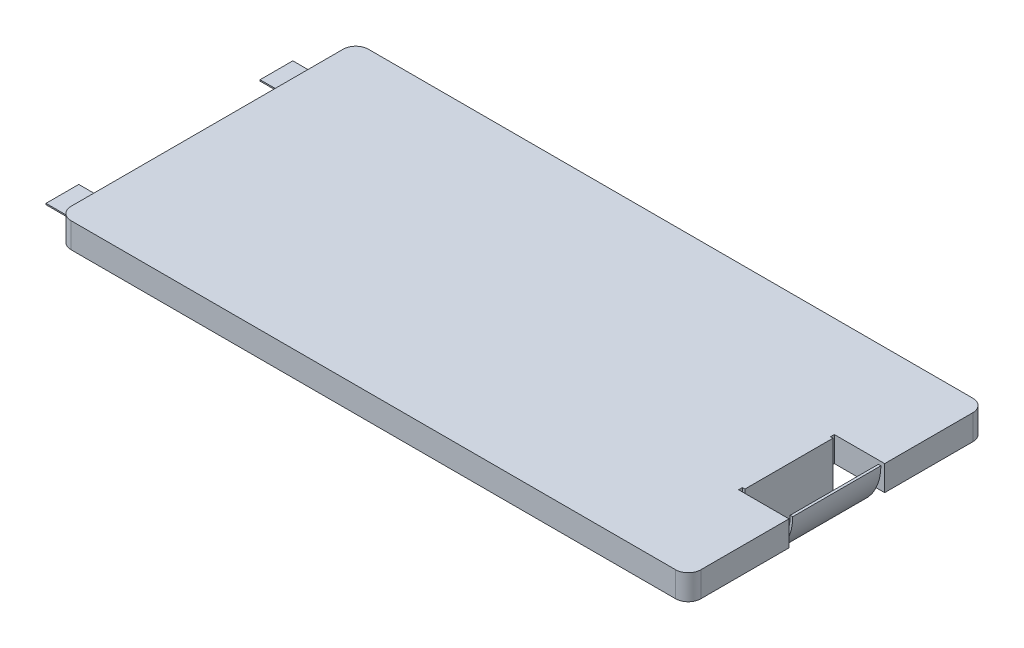
ISO-10303-21;
HEADER;
FILE_DESCRIPTION(('STEP AP214'),'2;1');
FILE_NAME('part.step','',(''),(''),'','','');
FILE_SCHEMA(('AUTOMOTIVE_DESIGN { 1 0 10303 214 1 1 1 1 }'));
ENDSEC;
DATA;
#1=APPLICATION_CONTEXT('core data for automotive mechanical design processes');
#2=APPLICATION_PROTOCOL_DEFINITION('international standard','automotive_design',2000,#1);
#3=PRODUCT_CONTEXT('',#1,'mechanical');
#4=PRODUCT('Part','Part','',(#3));
#5=PRODUCT_RELATED_PRODUCT_CATEGORY('part','',(#4));
#6=PRODUCT_DEFINITION_FORMATION('','',#4);
#7=PRODUCT_DEFINITION_CONTEXT('part definition',#1,'design');
#8=PRODUCT_DEFINITION('design','',#6,#7);
#9=PRODUCT_DEFINITION_SHAPE('','',#8);
#10=(LENGTH_UNIT() NAMED_UNIT(*) SI_UNIT(.MILLI.,.METRE.));
#11=(NAMED_UNIT(*) PLANE_ANGLE_UNIT() SI_UNIT($,.RADIAN.));
#12=(NAMED_UNIT(*) SI_UNIT($,.STERADIAN.) SOLID_ANGLE_UNIT());
#13=UNCERTAINTY_MEASURE_WITH_UNIT(LENGTH_MEASURE(1.E-05),#10,'distance_accuracy_value','');
#14=(GEOMETRIC_REPRESENTATION_CONTEXT(3) GLOBAL_UNCERTAINTY_ASSIGNED_CONTEXT((#13)) GLOBAL_UNIT_ASSIGNED_CONTEXT((#10,
#11,#12)) REPRESENTATION_CONTEXT('',''));
#15=CARTESIAN_POINT('',(0.,0.,0.));
#16=DIRECTION('',(0.,0.,1.));
#17=DIRECTION('',(1.,0.,0.));
#18=AXIS2_PLACEMENT_3D('',#15,#16,#17);
#19=CARTESIAN_POINT('',(-35.56,0.,-12.446));
#20=DIRECTION('',(0.,0.,1.));
#21=DIRECTION('',(0.,-1.,0.));
#22=AXIS2_PLACEMENT_3D('',#19,#20,#21);
#23=PLANE('',#22);
#24=DIRECTION('',(1.,0.,0.));
#25=VECTOR('',#24,1.);
#26=CARTESIAN_POINT('',(-35.56,0.127,-12.446));
#27=LINE('',#26,#25);
#28=CARTESIAN_POINT('',(-35.56,0.127,-12.446));
#29=VERTEX_POINT('',#28);
#30=CARTESIAN_POINT('',(-31.75,0.127,-12.446));
#31=VERTEX_POINT('',#30);
#32=EDGE_CURVE('E64',#29,#31,#27,.T.);
#33=ORIENTED_EDGE('',*,*,#32,.F.);
#34=DIRECTION('',(0.,-1.,0.));
#35=VECTOR('',#34,1.);
#36=CARTESIAN_POINT('',(-35.56,0.,-12.446));
#37=LINE('',#36,#35);
#38=CARTESIAN_POINT('',(-35.56,0.254,-12.446));
#39=VERTEX_POINT('',#38);
#40=EDGE_CURVE('E93',#39,#29,#37,.T.);
#41=ORIENTED_EDGE('',*,*,#40,.F.);
#42=DIRECTION('',(1.,0.,0.));
#43=VECTOR('',#42,1.);
#44=CARTESIAN_POINT('',(-35.56,0.254,-12.446));
#45=LINE('',#44,#43);
#46=CARTESIAN_POINT('',(-31.75,0.254,-12.446));
#47=VERTEX_POINT('',#46);
#48=EDGE_CURVE('E57',#39,#47,#45,.T.);
#49=ORIENTED_EDGE('',*,*,#48,.T.);
#50=DIRECTION('',(0.,-1.,0.));
#51=VECTOR('',#50,1.);
#52=CARTESIAN_POINT('',(-31.75,0.,-12.446));
#53=LINE('',#52,#51);
#54=EDGE_CURVE('E98',#47,#31,#53,.T.);
#55=ORIENTED_EDGE('',*,*,#54,.T.);
#56=EDGE_LOOP('',(#33,#41,#49,#55));
#57=FACE_BOUND('',#56,.T.);
#58=ADVANCED_FACE('F50',(#57),#23,.F.);
#59=CARTESIAN_POINT('',(-35.56,0.,-9.144));
#60=DIRECTION('',(0.,0.,-1.));
#61=DIRECTION('',(0.,1.,0.));
#62=AXIS2_PLACEMENT_3D('',#59,#60,#61);
#63=PLANE('',#62);
#64=DIRECTION('',(1.,0.,0.));
#65=VECTOR('',#64,1.);
#66=CARTESIAN_POINT('',(-35.56,0.127,-9.144));
#67=LINE('',#66,#65);
#68=CARTESIAN_POINT('',(-35.56,0.127,-9.144));
#69=VERTEX_POINT('',#68);
#70=CARTESIAN_POINT('',(-31.75,0.127,-9.144));
#71=VERTEX_POINT('',#70);
#72=EDGE_CURVE('E101',#69,#71,#67,.T.);
#73=ORIENTED_EDGE('',*,*,#72,.T.);
#74=DIRECTION('',(0.,1.,0.));
#75=VECTOR('',#74,1.);
#76=CARTESIAN_POINT('',(-31.75,0.,-9.144));
#77=LINE('',#76,#75);
#78=CARTESIAN_POINT('',(-31.75,0.254,-9.144));
#79=VERTEX_POINT('',#78);
#80=EDGE_CURVE('E94',#71,#79,#77,.T.);
#81=ORIENTED_EDGE('',*,*,#80,.T.);
#82=DIRECTION('',(1.,0.,0.));
#83=VECTOR('',#82,1.);
#84=CARTESIAN_POINT('',(-35.56,0.254,-9.144));
#85=LINE('',#84,#83);
#86=CARTESIAN_POINT('',(-35.56,0.254,-9.144));
#87=VERTEX_POINT('',#86);
#88=EDGE_CURVE('E12',#87,#79,#85,.T.);
#89=ORIENTED_EDGE('',*,*,#88,.F.);
#90=DIRECTION('',(0.,1.,0.));
#91=VECTOR('',#90,1.);
#92=CARTESIAN_POINT('',(-35.56,0.,-9.144));
#93=LINE('',#92,#91);
#94=EDGE_CURVE('E108',#69,#87,#93,.T.);
#95=ORIENTED_EDGE('',*,*,#94,.F.);
#96=EDGE_LOOP('',(#73,#81,#89,#95));
#97=FACE_BOUND('',#96,.T.);
#98=ADVANCED_FACE('F122',(#97),#63,.F.);
#99=CARTESIAN_POINT('',(-35.56,0.,0.));
#100=DIRECTION('',(1.,0.,0.));
#101=DIRECTION('',(0.,0.,-1.));
#102=AXIS2_PLACEMENT_3D('',#99,#100,#101);
#103=PLANE('',#102);
#104=DIRECTION('',(0.,0.,-1.));
#105=VECTOR('',#104,1.);
#106=CARTESIAN_POINT('',(-35.56,0.127,-12.446));
#107=LINE('',#106,#105);
#108=EDGE_CURVE('E112',#69,#29,#107,.T.);
#109=ORIENTED_EDGE('',*,*,#108,.F.);
#110=ORIENTED_EDGE('',*,*,#94,.T.);
#111=DIRECTION('',(0.,0.,-1.));
#112=VECTOR('',#111,1.);
#113=CARTESIAN_POINT('',(-35.56,0.254,-12.446));
#114=LINE('',#113,#112);
#115=EDGE_CURVE('E73',#87,#39,#114,.T.);
#116=ORIENTED_EDGE('',*,*,#115,.T.);
#117=ORIENTED_EDGE('',*,*,#40,.T.);
#118=EDGE_LOOP('',(#109,#110,#116,#117));
#119=FACE_BOUND('',#118,.T.);
#120=ADVANCED_FACE('F120',(#119),#103,.F.);
#121=CARTESIAN_POINT('',(-31.75,0.,0.));
#122=DIRECTION('',(1.,0.,0.));
#123=DIRECTION('',(0.,0.,-1.));
#124=AXIS2_PLACEMENT_3D('',#121,#122,#123);
#125=PLANE('',#124);
#126=ORIENTED_EDGE('',*,*,#80,.F.);
#127=DIRECTION('',(0.,0.,-1.));
#128=VECTOR('',#127,1.);
#129=CARTESIAN_POINT('',(-31.75,0.127,-12.446));
#130=LINE('',#129,#128);
#131=EDGE_CURVE('E100',#71,#31,#130,.T.);
#132=ORIENTED_EDGE('',*,*,#131,.T.);
#133=ORIENTED_EDGE('',*,*,#54,.F.);
#134=DIRECTION('',(0.,0.,-1.));
#135=VECTOR('',#134,1.);
#136=CARTESIAN_POINT('',(-31.75,0.254,-12.446));
#137=LINE('',#136,#135);
#138=EDGE_CURVE('E85',#79,#47,#137,.T.);
#139=ORIENTED_EDGE('',*,*,#138,.F.);
#140=EDGE_LOOP('',(#126,#132,#133,#139));
#141=FACE_BOUND('',#140,.T.);
#142=ADVANCED_FACE('F99',(#141),#125,.T.);
#143=CARTESIAN_POINT('',(-35.56,0.254,-12.446));
#144=DIRECTION('',(0.,-1.,0.));
#145=DIRECTION('',(0.,0.,-1.));
#146=AXIS2_PLACEMENT_3D('',#143,#144,#145);
#147=PLANE('',#146);
#148=ORIENTED_EDGE('',*,*,#138,.T.);
#149=ORIENTED_EDGE('',*,*,#48,.F.);
#150=ORIENTED_EDGE('',*,*,#115,.F.);
#151=ORIENTED_EDGE('',*,*,#88,.T.);
#152=EDGE_LOOP('',(#148,#149,#150,#151));
#153=FACE_BOUND('',#152,.T.);
#154=ADVANCED_FACE('F87',(#153),#147,.F.);
#155=CARTESIAN_POINT('',(-35.56,0.127,-12.446));
#156=DIRECTION('',(0.,-1.,0.));
#157=DIRECTION('',(0.,0.,-1.));
#158=AXIS2_PLACEMENT_3D('',#155,#156,#157);
#159=PLANE('',#158);
#160=ORIENTED_EDGE('',*,*,#131,.F.);
#161=ORIENTED_EDGE('',*,*,#72,.F.);
#162=ORIENTED_EDGE('',*,*,#108,.T.);
#163=ORIENTED_EDGE('',*,*,#32,.T.);
#164=EDGE_LOOP('',(#160,#161,#162,#163));
#165=FACE_BOUND('',#164,.T.);
#166=ADVANCED_FACE('F116',(#165),#159,.T.);
#167=CLOSED_SHELL('',(#58,#98,#120,#142,#154,#166));
#168=MANIFOLD_SOLID_BREP('B2',#167);
#169=CARTESIAN_POINT('',(-35.56,0.,9.144));
#170=DIRECTION('',(0.,0.,1.));
#171=DIRECTION('',(1.,0.,0.));
#172=AXIS2_PLACEMENT_3D('',#169,#170,#171);
#173=PLANE('',#172);
#174=DIRECTION('',(1.,0.,0.));
#175=VECTOR('',#174,1.);
#176=CARTESIAN_POINT('',(-35.56,0.127,9.144));
#177=LINE('',#176,#175);
#178=CARTESIAN_POINT('',(-35.56,0.127,9.144));
#179=VERTEX_POINT('',#178);
#180=CARTESIAN_POINT('',(-31.75,0.127,9.144));
#181=VERTEX_POINT('',#180);
#182=EDGE_CURVE('E197',#179,#181,#177,.T.);
#183=ORIENTED_EDGE('',*,*,#182,.F.);
#184=DIRECTION('',(0.,-1.,0.));
#185=VECTOR('',#184,1.);
#186=CARTESIAN_POINT('',(-35.56,0.,9.144));
#187=LINE('',#186,#185);
#188=CARTESIAN_POINT('',(-35.56,0.254,9.144));
#189=VERTEX_POINT('',#188);
#190=EDGE_CURVE('E226',#189,#179,#187,.T.);
#191=ORIENTED_EDGE('',*,*,#190,.F.);
#192=DIRECTION('',(1.,0.,0.));
#193=VECTOR('',#192,1.);
#194=CARTESIAN_POINT('',(-35.56,0.254,9.144));
#195=LINE('',#194,#193);
#196=CARTESIAN_POINT('',(-31.75,0.254,9.144));
#197=VERTEX_POINT('',#196);
#198=EDGE_CURVE('E190',#189,#197,#195,.T.);
#199=ORIENTED_EDGE('',*,*,#198,.T.);
#200=DIRECTION('',(0.,-1.,0.));
#201=VECTOR('',#200,1.);
#202=CARTESIAN_POINT('',(-31.75,0.,9.144));
#203=LINE('',#202,#201);
#204=EDGE_CURVE('E231',#197,#181,#203,.T.);
#205=ORIENTED_EDGE('',*,*,#204,.T.);
#206=EDGE_LOOP('',(#183,#191,#199,#205));
#207=FACE_BOUND('',#206,.T.);
#208=ADVANCED_FACE('F183',(#207),#173,.F.);
#209=CARTESIAN_POINT('',(-35.56,0.,12.446));
#210=DIRECTION('',(0.,0.,-1.));
#211=DIRECTION('',(-1.,0.,0.));
#212=AXIS2_PLACEMENT_3D('',#209,#210,#211);
#213=PLANE('',#212);
#214=DIRECTION('',(1.,0.,0.));
#215=VECTOR('',#214,1.);
#216=CARTESIAN_POINT('',(-35.56,0.127,12.446));
#217=LINE('',#216,#215);
#218=CARTESIAN_POINT('',(-35.56,0.127,12.446));
#219=VERTEX_POINT('',#218);
#220=CARTESIAN_POINT('',(-31.75,0.127,12.446));
#221=VERTEX_POINT('',#220);
#222=EDGE_CURVE('E234',#219,#221,#217,.T.);
#223=ORIENTED_EDGE('',*,*,#222,.T.);
#224=DIRECTION('',(0.,1.,0.));
#225=VECTOR('',#224,1.);
#226=CARTESIAN_POINT('',(-31.75,0.,12.446));
#227=LINE('',#226,#225);
#228=CARTESIAN_POINT('',(-31.75,0.254,12.446));
#229=VERTEX_POINT('',#228);
#230=EDGE_CURVE('E227',#221,#229,#227,.T.);
#231=ORIENTED_EDGE('',*,*,#230,.T.);
#232=DIRECTION('',(1.,0.,0.));
#233=VECTOR('',#232,1.);
#234=CARTESIAN_POINT('',(-35.56,0.254,12.446));
#235=LINE('',#234,#233);
#236=CARTESIAN_POINT('',(-35.56,0.254,12.446));
#237=VERTEX_POINT('',#236);
#238=EDGE_CURVE('E48',#237,#229,#235,.T.);
#239=ORIENTED_EDGE('',*,*,#238,.F.);
#240=DIRECTION('',(0.,1.,0.));
#241=VECTOR('',#240,1.);
#242=CARTESIAN_POINT('',(-35.56,0.,12.446));
#243=LINE('',#242,#241);
#244=EDGE_CURVE('E241',#219,#237,#243,.T.);
#245=ORIENTED_EDGE('',*,*,#244,.F.);
#246=EDGE_LOOP('',(#223,#231,#239,#245));
#247=FACE_BOUND('',#246,.T.);
#248=ADVANCED_FACE('F255',(#247),#213,.F.);
#249=CARTESIAN_POINT('',(-35.56,0.,0.));
#250=DIRECTION('',(1.,0.,0.));
#251=DIRECTION('',(0.,0.,-1.));
#252=AXIS2_PLACEMENT_3D('',#249,#250,#251);
#253=PLANE('',#252);
#254=DIRECTION('',(0.,0.,-1.));
#255=VECTOR('',#254,1.);
#256=CARTESIAN_POINT('',(-35.56,0.127,12.446));
#257=LINE('',#256,#255);
#258=EDGE_CURVE('E245',#219,#179,#257,.T.);
#259=ORIENTED_EDGE('',*,*,#258,.F.);
#260=ORIENTED_EDGE('',*,*,#244,.T.);
#261=DIRECTION('',(0.,0.,-1.));
#262=VECTOR('',#261,1.);
#263=CARTESIAN_POINT('',(-35.56,0.254,9.144));
#264=LINE('',#263,#262);
#265=EDGE_CURVE('E206',#237,#189,#264,.T.);
#266=ORIENTED_EDGE('',*,*,#265,.T.);
#267=ORIENTED_EDGE('',*,*,#190,.T.);
#268=EDGE_LOOP('',(#259,#260,#266,#267));
#269=FACE_BOUND('',#268,.T.);
#270=ADVANCED_FACE('F253',(#269),#253,.F.);
#271=CARTESIAN_POINT('',(-31.75,0.,0.));
#272=DIRECTION('',(1.,0.,0.));
#273=DIRECTION('',(0.,0.,-1.));
#274=AXIS2_PLACEMENT_3D('',#271,#272,#273);
#275=PLANE('',#274);
#276=ORIENTED_EDGE('',*,*,#230,.F.);
#277=DIRECTION('',(0.,0.,-1.));
#278=VECTOR('',#277,1.);
#279=CARTESIAN_POINT('',(-31.75,0.127,12.446));
#280=LINE('',#279,#278);
#281=EDGE_CURVE('E233',#221,#181,#280,.T.);
#282=ORIENTED_EDGE('',*,*,#281,.T.);
#283=ORIENTED_EDGE('',*,*,#204,.F.);
#284=DIRECTION('',(0.,0.,-1.));
#285=VECTOR('',#284,1.);
#286=CARTESIAN_POINT('',(-31.75,0.254,9.144));
#287=LINE('',#286,#285);
#288=EDGE_CURVE('E218',#229,#197,#287,.T.);
#289=ORIENTED_EDGE('',*,*,#288,.F.);
#290=EDGE_LOOP('',(#276,#282,#283,#289));
#291=FACE_BOUND('',#290,.T.);
#292=ADVANCED_FACE('F232',(#291),#275,.T.);
#293=CARTESIAN_POINT('',(-35.56,0.254,9.144));
#294=DIRECTION('',(0.,-1.,0.));
#295=DIRECTION('',(0.,0.,-1.));
#296=AXIS2_PLACEMENT_3D('',#293,#294,#295);
#297=PLANE('',#296);
#298=ORIENTED_EDGE('',*,*,#288,.T.);
#299=ORIENTED_EDGE('',*,*,#198,.F.);
#300=ORIENTED_EDGE('',*,*,#265,.F.);
#301=ORIENTED_EDGE('',*,*,#238,.T.);
#302=EDGE_LOOP('',(#298,#299,#300,#301));
#303=FACE_BOUND('',#302,.T.);
#304=ADVANCED_FACE('F220',(#303),#297,.F.);
#305=CARTESIAN_POINT('',(-35.56,0.127,12.446));
#306=DIRECTION('',(0.,-1.,0.));
#307=DIRECTION('',(0.,0.,-1.));
#308=AXIS2_PLACEMENT_3D('',#305,#306,#307);
#309=PLANE('',#308);
#310=ORIENTED_EDGE('',*,*,#281,.F.);
#311=ORIENTED_EDGE('',*,*,#222,.F.);
#312=ORIENTED_EDGE('',*,*,#258,.T.);
#313=ORIENTED_EDGE('',*,*,#182,.T.);
#314=EDGE_LOOP('',(#310,#311,#312,#313));
#315=FACE_BOUND('',#314,.T.);
#316=ADVANCED_FACE('F249',(#315),#309,.T.);
#317=CLOSED_SHELL('',(#208,#248,#270,#292,#304,#316));
#318=MANIFOLD_SOLID_BREP('B6',#317);
#319=CARTESIAN_POINT('',(26.67,0.,-4.826));
#320=DIRECTION('',(-1.,0.,0.));
#321=DIRECTION('',(0.,0.,1.));
#322=AXIS2_PLACEMENT_3D('',#319,#320,#321);
#323=PLANE('',#322);
#324=DIRECTION('',(0.,-1.,0.));
#325=VECTOR('',#324,1.);
#326=CARTESIAN_POINT('',(26.67,2.54,-4.445));
#327=LINE('',#326,#325);
#328=CARTESIAN_POINT('',(26.67,2.54,-4.445));
#329=VERTEX_POINT('',#328);
#330=CARTESIAN_POINT('',(26.67,0.,-4.445));
#331=VERTEX_POINT('',#330);
#332=EDGE_CURVE('E594',#329,#331,#327,.T.);
#333=ORIENTED_EDGE('',*,*,#332,.T.);
#334=DIRECTION('',(0.,0.,1.));
#335=VECTOR('',#334,1.);
#336=CARTESIAN_POINT('',(26.67,0.,-4.826));
#337=LINE('',#336,#335);
#338=CARTESIAN_POINT('',(26.67,0.,-4.826));
#339=VERTEX_POINT('',#338);
#340=EDGE_CURVE('E585',#339,#331,#337,.T.);
#341=ORIENTED_EDGE('',*,*,#340,.F.);
#342=DIRECTION('',(0.,1.,0.));
#343=VECTOR('',#342,1.);
#344=CARTESIAN_POINT('',(26.67,0.,-4.826));
#345=LINE('',#344,#343);
#346=CARTESIAN_POINT('',(26.67,2.54,-4.826));
#347=VERTEX_POINT('',#346);
#348=EDGE_CURVE('E504',#339,#347,#345,.T.);
#349=ORIENTED_EDGE('',*,*,#348,.T.);
#350=DIRECTION('',(0.,0.,1.));
#351=VECTOR('',#350,1.);
#352=CARTESIAN_POINT('',(26.67,2.54,-4.826));
#353=LINE('',#352,#351);
#354=EDGE_CURVE('E491',#347,#329,#353,.T.);
#355=ORIENTED_EDGE('',*,*,#354,.T.);
#356=EDGE_LOOP('',(#333,#341,#349,#355));
#357=FACE_BOUND('',#356,.T.);
#358=ADVANCED_FACE('F307',(#357),#323,.F.);
#359=CARTESIAN_POINT('',(0.,0.,0.));
#360=DIRECTION('',(0.,1.,0.));
#361=DIRECTION('',(0.,0.,1.));
#362=AXIS2_PLACEMENT_3D('',#359,#360,#361);
#363=PLANE('',#362);
#364=DIRECTION('',(-1.,0.,0.));
#365=VECTOR('',#364,1.);
#366=CARTESIAN_POINT('',(29.0565535122826,0.,3.556));
#367=LINE('',#366,#365);
#368=CARTESIAN_POINT('',(26.67,0.,3.556));
#369=VERTEX_POINT('',#368);
#370=CARTESIAN_POINT('',(24.2834464877174,0.,3.556));
#371=VERTEX_POINT('',#370);
#372=EDGE_CURVE('E181',#369,#371,#367,.T.);
#373=ORIENTED_EDGE('',*,*,#372,.F.);
#374=CARTESIAN_POINT('',(26.67,0.,4.445));
#375=VERTEX_POINT('',#374);
#376=EDGE_CURVE('E595',#369,#375,#337,.T.);
#377=ORIENTED_EDGE('',*,*,#376,.T.);
#378=CARTESIAN_POINT('',(26.67,0.,4.826));
#379=VERTEX_POINT('',#378);
#380=EDGE_CURVE('E482',#375,#379,#337,.T.);
#381=ORIENTED_EDGE('',*,*,#380,.T.);
#382=DIRECTION('',(1.,0.,0.));
#383=VECTOR('',#382,1.);
#384=CARTESIAN_POINT('',(36.83,0.,4.826));
#385=LINE('',#384,#383);
#386=CARTESIAN_POINT('',(31.75,0.,4.826));
#387=VERTEX_POINT('',#386);
#388=EDGE_CURVE('E499',#379,#387,#385,.T.);
#389=ORIENTED_EDGE('',*,*,#388,.T.);
#390=DIRECTION('',(0.,0.,-1.));
#391=VECTOR('',#390,1.);
#392=CARTESIAN_POINT('',(31.75,0.,-14.986));
#393=LINE('',#392,#391);
#394=CARTESIAN_POINT('',(31.75,0.,13.716));
#395=VERTEX_POINT('',#394);
#396=EDGE_CURVE('E529',#395,#387,#393,.T.);
#397=ORIENTED_EDGE('',*,*,#396,.F.);
#398=CARTESIAN_POINT('',(30.48,0.,13.716));
#399=DIRECTION('',(0.,1.,0.));
#400=DIRECTION('',(0.,0.,1.));
#401=AXIS2_PLACEMENT_3D('',#398,#399,#400);
#402=CIRCLE('',#401,1.27);
#403=CARTESIAN_POINT('',(30.48,0.,14.986));
#404=VERTEX_POINT('',#403);
#405=EDGE_CURVE('E544',#395,#404,#402,.F.);
#406=ORIENTED_EDGE('',*,*,#405,.T.);
#407=DIRECTION('',(1.,0.,0.));
#408=VECTOR('',#407,1.);
#409=CARTESIAN_POINT('',(-31.75,0.,14.986));
#410=LINE('',#409,#408);
#411=CARTESIAN_POINT('',(-30.48,0.,14.986));
#412=VERTEX_POINT('',#411);
#413=EDGE_CURVE('E537',#412,#404,#410,.T.);
#414=ORIENTED_EDGE('',*,*,#413,.F.);
#415=CARTESIAN_POINT('',(-30.48,0.,13.716));
#416=DIRECTION('',(0.,1.,0.));
#417=DIRECTION('',(0.,0.,1.));
#418=AXIS2_PLACEMENT_3D('',#415,#416,#417);
#419=CIRCLE('',#418,1.27);
#420=CARTESIAN_POINT('',(-31.75,0.,13.716));
#421=VERTEX_POINT('',#420);
#422=EDGE_CURVE('E549',#412,#421,#419,.F.);
#423=ORIENTED_EDGE('',*,*,#422,.T.);
#424=DIRECTION('',(0.,0.,1.));
#425=VECTOR('',#424,1.);
#426=CARTESIAN_POINT('',(-31.75,0.,-14.986));
#427=LINE('',#426,#425);
#428=CARTESIAN_POINT('',(-31.75,0.,-13.716));
#429=VERTEX_POINT('',#428);
#430=EDGE_CURVE('E535',#429,#421,#427,.T.);
#431=ORIENTED_EDGE('',*,*,#430,.F.);
#432=CARTESIAN_POINT('',(-30.48,0.,-13.716));
#433=DIRECTION('',(0.,1.,0.));
#434=DIRECTION('',(0.,0.,1.));
#435=AXIS2_PLACEMENT_3D('',#432,#433,#434);
#436=CIRCLE('',#435,1.27);
#437=CARTESIAN_POINT('',(-30.48,0.,-14.986));
#438=VERTEX_POINT('',#437);
#439=EDGE_CURVE('E552',#429,#438,#436,.F.);
#440=ORIENTED_EDGE('',*,*,#439,.T.);
#441=DIRECTION('',(-1.,0.,0.));
#442=VECTOR('',#441,1.);
#443=CARTESIAN_POINT('',(-31.75,0.,-14.986));
#444=LINE('',#443,#442);
#445=CARTESIAN_POINT('',(30.48,0.,-14.986));
#446=VERTEX_POINT('',#445);
#447=EDGE_CURVE('E532',#446,#438,#444,.T.);
#448=ORIENTED_EDGE('',*,*,#447,.F.);
#449=CARTESIAN_POINT('',(30.48,0.,-13.716));
#450=DIRECTION('',(0.,1.,0.));
#451=DIRECTION('',(0.,0.,1.));
#452=AXIS2_PLACEMENT_3D('',#449,#450,#451);
#453=CIRCLE('',#452,1.27);
#454=CARTESIAN_POINT('',(31.75,0.,-13.716));
#455=VERTEX_POINT('',#454);
#456=EDGE_CURVE('E546',#446,#455,#453,.F.);
#457=ORIENTED_EDGE('',*,*,#456,.T.);
#458=CARTESIAN_POINT('',(31.75,0.,-4.826));
#459=VERTEX_POINT('',#458);
#460=EDGE_CURVE('E515',#459,#455,#393,.T.);
#461=ORIENTED_EDGE('',*,*,#460,.F.);
#462=DIRECTION('',(-1.,0.,0.));
#463=VECTOR('',#462,1.);
#464=CARTESIAN_POINT('',(0.,0.,-4.826));
#465=LINE('',#464,#463);
#466=EDGE_CURVE('E311',#459,#339,#465,.T.);
#467=ORIENTED_EDGE('',*,*,#466,.T.);
#468=ORIENTED_EDGE('',*,*,#340,.T.);
#469=DIRECTION('',(0.,0.,-1.));
#470=VECTOR('',#469,1.);
#471=CARTESIAN_POINT('',(26.67,0.,0.));
#472=LINE('',#471,#470);
#473=CARTESIAN_POINT('',(26.67,0.,-3.556));
#474=VERTEX_POINT('',#473);
#475=EDGE_CURVE('E922',#474,#331,#472,.T.);
#476=ORIENTED_EDGE('',*,*,#475,.F.);
#477=DIRECTION('',(1.,0.,0.));
#478=VECTOR('',#477,1.);
#479=CARTESIAN_POINT('',(29.0565535122826,0.,-3.556));
#480=LINE('',#479,#478);
#481=CARTESIAN_POINT('',(24.2834464877174,0.,-3.556));
#482=VERTEX_POINT('',#481);
#483=EDGE_CURVE('E327',#482,#474,#480,.T.);
#484=ORIENTED_EDGE('',*,*,#483,.F.);
#485=DIRECTION('',(0.,0.,-1.));
#486=VECTOR('',#485,1.);
#487=CARTESIAN_POINT('',(24.2834464877174,0.,3.556));
#488=LINE('',#487,#486);
#489=EDGE_CURVE('E323',#371,#482,#488,.T.);
#490=ORIENTED_EDGE('',*,*,#489,.F.);
#491=EDGE_LOOP('',(#373,#377,#381,#389,#397,#406,#414,#423,#431,#440,#448,#457,#461,#467,#468,
#476,#484,#490));
#492=FACE_BOUND('',#491,.T.);
#493=ADVANCED_FACE('F583',(#492),#363,.F.);
#494=CARTESIAN_POINT('',(31.75,2.54,-14.986));
#495=DIRECTION('',(-1.,0.,0.));
#496=DIRECTION('',(0.,0.,1.));
#497=AXIS2_PLACEMENT_3D('',#494,#495,#496);
#498=PLANE('',#497);
#499=DIRECTION('',(0.,0.,-1.));
#500=VECTOR('',#499,1.);
#501=CARTESIAN_POINT('',(31.75,2.54,-14.986));
#502=LINE('',#501,#500);
#503=CARTESIAN_POINT('',(31.75,2.54,-4.826));
#504=VERTEX_POINT('',#503);
#505=CARTESIAN_POINT('',(31.75,2.54,-13.716));
#506=VERTEX_POINT('',#505);
#507=EDGE_CURVE('E519',#504,#506,#502,.T.);
#508=ORIENTED_EDGE('',*,*,#507,.F.);
#509=DIRECTION('',(0.,-1.,0.));
#510=VECTOR('',#509,1.);
#511=CARTESIAN_POINT('',(31.75,2.54,-4.826));
#512=LINE('',#511,#510);
#513=EDGE_CURVE('E512',#504,#459,#512,.T.);
#514=ORIENTED_EDGE('',*,*,#513,.T.);
#515=ORIENTED_EDGE('',*,*,#460,.T.);
#516=DIRECTION('',(0.,-1.,0.));
#517=VECTOR('',#516,1.);
#518=CARTESIAN_POINT('',(31.75,2.54,-13.716));
#519=LINE('',#518,#517);
#520=EDGE_CURVE('E574',#455,#506,#519,.F.);
#521=ORIENTED_EDGE('',*,*,#520,.T.);
#522=EDGE_LOOP('',(#508,#514,#515,#521));
#523=FACE_BOUND('',#522,.T.);
#524=ADVANCED_FACE('F588',(#523),#498,.F.);
#525=ORIENTED_EDGE('',*,*,#396,.T.);
#526=DIRECTION('',(0.,1.,0.));
#527=VECTOR('',#526,1.);
#528=CARTESIAN_POINT('',(31.75,2.54,4.826));
#529=LINE('',#528,#527);
#530=CARTESIAN_POINT('',(31.75,2.54,4.826));
#531=VERTEX_POINT('',#530);
#532=EDGE_CURVE('E507',#387,#531,#529,.T.);
#533=ORIENTED_EDGE('',*,*,#532,.T.);
#534=CARTESIAN_POINT('',(31.75,2.54,13.716));
#535=VERTEX_POINT('',#534);
#536=EDGE_CURVE('E516',#535,#531,#502,.T.);
#537=ORIENTED_EDGE('',*,*,#536,.F.);
#538=DIRECTION('',(0.,-1.,0.));
#539=VECTOR('',#538,1.);
#540=CARTESIAN_POINT('',(31.75,2.54,13.716));
#541=LINE('',#540,#539);
#542=EDGE_CURVE('E572',#535,#395,#541,.T.);
#543=ORIENTED_EDGE('',*,*,#542,.T.);
#544=EDGE_LOOP('',(#525,#533,#537,#543));
#545=FACE_BOUND('',#544,.T.);
#546=ADVANCED_FACE('F604',(#545),#498,.F.);
#547=CARTESIAN_POINT('',(-31.75,2.54,-14.986));
#548=DIRECTION('',(0.,0.,1.));
#549=DIRECTION('',(1.,0.,0.));
#550=AXIS2_PLACEMENT_3D('',#547,#548,#549);
#551=PLANE('',#550);
#552=ORIENTED_EDGE('',*,*,#447,.T.);
#553=DIRECTION('',(0.,-1.,0.));
#554=VECTOR('',#553,1.);
#555=CARTESIAN_POINT('',(-30.48,2.54,-14.986));
#556=LINE('',#555,#554);
#557=CARTESIAN_POINT('',(-30.48,2.54,-14.986));
#558=VERTEX_POINT('',#557);
#559=EDGE_CURVE('E557',#438,#558,#556,.F.);
#560=ORIENTED_EDGE('',*,*,#559,.T.);
#561=DIRECTION('',(-1.,0.,0.));
#562=VECTOR('',#561,1.);
#563=CARTESIAN_POINT('',(-31.75,2.54,-14.986));
#564=LINE('',#563,#562);
#565=CARTESIAN_POINT('',(30.48,2.54,-14.986));
#566=VERTEX_POINT('',#565);
#567=EDGE_CURVE('E518',#566,#558,#564,.T.);
#568=ORIENTED_EDGE('',*,*,#567,.F.);
#569=DIRECTION('',(0.,-1.,0.));
#570=VECTOR('',#569,1.);
#571=CARTESIAN_POINT('',(30.48,2.54,-14.986));
#572=LINE('',#571,#570);
#573=EDGE_CURVE('E554',#566,#446,#572,.T.);
#574=ORIENTED_EDGE('',*,*,#573,.T.);
#575=EDGE_LOOP('',(#552,#560,#568,#574));
#576=FACE_BOUND('',#575,.T.);
#577=ADVANCED_FACE('F629',(#576),#551,.F.);
#578=CARTESIAN_POINT('',(-31.75,2.54,-14.986));
#579=DIRECTION('',(1.,0.,0.));
#580=DIRECTION('',(0.,0.,-1.));
#581=AXIS2_PLACEMENT_3D('',#578,#579,#580);
#582=PLANE('',#581);
#583=ORIENTED_EDGE('',*,*,#430,.T.);
#584=DIRECTION('',(0.,-1.,0.));
#585=VECTOR('',#584,1.);
#586=CARTESIAN_POINT('',(-31.75,2.54,13.716));
#587=LINE('',#586,#585);
#588=CARTESIAN_POINT('',(-31.75,2.54,13.716));
#589=VERTEX_POINT('',#588);
#590=EDGE_CURVE('E528',#421,#589,#587,.F.);
#591=ORIENTED_EDGE('',*,*,#590,.T.);
#592=DIRECTION('',(0.,0.,1.));
#593=VECTOR('',#592,1.);
#594=CARTESIAN_POINT('',(-31.75,2.54,-14.986));
#595=LINE('',#594,#593);
#596=CARTESIAN_POINT('',(-31.75,2.54,-13.716));
#597=VERTEX_POINT('',#596);
#598=EDGE_CURVE('E522',#597,#589,#595,.T.);
#599=ORIENTED_EDGE('',*,*,#598,.F.);
#600=DIRECTION('',(0.,-1.,0.));
#601=VECTOR('',#600,1.);
#602=CARTESIAN_POINT('',(-31.75,2.54,-13.716));
#603=LINE('',#602,#601);
#604=EDGE_CURVE('E541',#597,#429,#603,.T.);
#605=ORIENTED_EDGE('',*,*,#604,.T.);
#606=EDGE_LOOP('',(#583,#591,#599,#605));
#607=FACE_BOUND('',#606,.T.);
#608=ADVANCED_FACE('F621',(#607),#582,.F.);
#609=CARTESIAN_POINT('',(-31.75,2.54,14.986));
#610=DIRECTION('',(0.,0.,-1.));
#611=DIRECTION('',(-1.,0.,0.));
#612=AXIS2_PLACEMENT_3D('',#609,#610,#611);
#613=PLANE('',#612);
#614=DIRECTION('',(1.,0.,0.));
#615=VECTOR('',#614,1.);
#616=CARTESIAN_POINT('',(-31.75,2.54,14.986));
#617=LINE('',#616,#615);
#618=CARTESIAN_POINT('',(-30.48,2.54,14.986));
#619=VERTEX_POINT('',#618);
#620=CARTESIAN_POINT('',(30.48,2.54,14.986));
#621=VERTEX_POINT('',#620);
#622=EDGE_CURVE('E525',#619,#621,#617,.T.);
#623=ORIENTED_EDGE('',*,*,#622,.F.);
#624=DIRECTION('',(0.,-1.,0.));
#625=VECTOR('',#624,1.);
#626=CARTESIAN_POINT('',(-30.48,2.54,14.986));
#627=LINE('',#626,#625);
#628=EDGE_CURVE('E569',#619,#412,#627,.T.);
#629=ORIENTED_EDGE('',*,*,#628,.T.);
#630=ORIENTED_EDGE('',*,*,#413,.T.);
#631=DIRECTION('',(0.,-1.,0.));
#632=VECTOR('',#631,1.);
#633=CARTESIAN_POINT('',(30.48,2.54,14.986));
#634=LINE('',#633,#632);
#635=EDGE_CURVE('E567',#404,#621,#634,.F.);
#636=ORIENTED_EDGE('',*,*,#635,.T.);
#637=EDGE_LOOP('',(#623,#629,#630,#636));
#638=FACE_BOUND('',#637,.T.);
#639=ADVANCED_FACE('F612',(#638),#613,.F.);
#640=CARTESIAN_POINT('',(0.,2.54,0.));
#641=DIRECTION('',(0.,1.,0.));
#642=DIRECTION('',(0.,0.,1.));
#643=AXIS2_PLACEMENT_3D('',#640,#641,#642);
#644=PLANE('',#643);
#645=DIRECTION('',(-1.,0.,0.));
#646=VECTOR('',#645,1.);
#647=CARTESIAN_POINT('',(36.83,2.54,-4.826));
#648=LINE('',#647,#646);
#649=EDGE_CURVE('E502',#504,#347,#648,.T.);
#650=ORIENTED_EDGE('',*,*,#649,.F.);
#651=ORIENTED_EDGE('',*,*,#507,.T.);
#652=CARTESIAN_POINT('',(30.48,2.54,-13.716));
#653=DIRECTION('',(0.,1.,0.));
#654=DIRECTION('',(0.,0.,1.));
#655=AXIS2_PLACEMENT_3D('',#652,#653,#654);
#656=CIRCLE('',#655,1.27);
#657=EDGE_CURVE('E561',#506,#566,#656,.T.);
#658=ORIENTED_EDGE('',*,*,#657,.T.);
#659=ORIENTED_EDGE('',*,*,#567,.T.);
#660=CARTESIAN_POINT('',(-30.48,2.54,-13.716));
#661=DIRECTION('',(0.,1.,0.));
#662=DIRECTION('',(0.,0.,1.));
#663=AXIS2_PLACEMENT_3D('',#660,#661,#662);
#664=CIRCLE('',#663,1.27);
#665=EDGE_CURVE('E565',#558,#597,#664,.T.);
#666=ORIENTED_EDGE('',*,*,#665,.T.);
#667=ORIENTED_EDGE('',*,*,#598,.T.);
#668=CARTESIAN_POINT('',(-30.48,2.54,13.716));
#669=DIRECTION('',(0.,1.,0.));
#670=DIRECTION('',(0.,0.,1.));
#671=AXIS2_PLACEMENT_3D('',#668,#669,#670);
#672=CIRCLE('',#671,1.27);
#673=EDGE_CURVE('E563',#589,#619,#672,.T.);
#674=ORIENTED_EDGE('',*,*,#673,.T.);
#675=ORIENTED_EDGE('',*,*,#622,.T.);
#676=CARTESIAN_POINT('',(30.48,2.54,13.716));
#677=DIRECTION('',(0.,1.,0.));
#678=DIRECTION('',(0.,0.,1.));
#679=AXIS2_PLACEMENT_3D('',#676,#677,#678);
#680=CIRCLE('',#679,1.27);
#681=EDGE_CURVE('E559',#621,#535,#680,.T.);
#682=ORIENTED_EDGE('',*,*,#681,.T.);
#683=ORIENTED_EDGE('',*,*,#536,.T.);
#684=DIRECTION('',(1.,0.,0.));
#685=VECTOR('',#684,1.);
#686=CARTESIAN_POINT('',(36.83,2.54,4.826));
#687=LINE('',#686,#685);
#688=CARTESIAN_POINT('',(26.67,2.54,4.826));
#689=VERTEX_POINT('',#688);
#690=EDGE_CURVE('E490',#689,#531,#687,.T.);
#691=ORIENTED_EDGE('',*,*,#690,.F.);
#692=CARTESIAN_POINT('',(26.67,2.54,4.445));
#693=VERTEX_POINT('',#692);
#694=EDGE_CURVE('E480',#693,#689,#353,.T.);
#695=ORIENTED_EDGE('',*,*,#694,.F.);
#696=DIRECTION('',(-1.,0.,0.));
#697=VECTOR('',#696,1.);
#698=CARTESIAN_POINT('',(26.67,2.54,4.445));
#699=LINE('',#698,#697);
#700=CARTESIAN_POINT('',(26.924,2.54,4.445));
#701=VERTEX_POINT('',#700);
#702=EDGE_CURVE('E463',#701,#693,#699,.T.);
#703=ORIENTED_EDGE('',*,*,#702,.F.);
#704=DIRECTION('',(0.,0.,-1.));
#705=VECTOR('',#704,1.);
#706=CARTESIAN_POINT('',(26.924,2.54,4.445));
#707=LINE('',#706,#705);
#708=CARTESIAN_POINT('',(26.924,2.54,-4.445));
#709=VERTEX_POINT('',#708);
#710=EDGE_CURVE('E898',#701,#709,#707,.T.);
#711=ORIENTED_EDGE('',*,*,#710,.T.);
#712=DIRECTION('',(-1.,0.,0.));
#713=VECTOR('',#712,1.);
#714=CARTESIAN_POINT('',(26.67,2.54,-4.445));
#715=LINE('',#714,#713);
#716=EDGE_CURVE('E899',#709,#329,#715,.T.);
#717=ORIENTED_EDGE('',*,*,#716,.T.);
#718=ORIENTED_EDGE('',*,*,#354,.F.);
#719=EDGE_LOOP('',(#650,#651,#658,#659,#666,#667,#674,#675,#682,#683,#691,#695,#703,#711,#717,#718));
#720=FACE_BOUND('',#719,.T.);
#721=ADVANCED_FACE('F488',(#720),#644,.T.);
#722=CARTESIAN_POINT('',(-30.48,2.54,-13.716));
#723=DIRECTION('',(0.,-1.,0.));
#724=DIRECTION('',(0.,0.,-1.));
#725=AXIS2_PLACEMENT_3D('',#722,#723,#724);
#726=CYLINDRICAL_SURFACE('',#725,1.27);
#727=ORIENTED_EDGE('',*,*,#665,.F.);
#728=ORIENTED_EDGE('',*,*,#559,.F.);
#729=ORIENTED_EDGE('',*,*,#439,.F.);
#730=ORIENTED_EDGE('',*,*,#604,.F.);
#731=EDGE_LOOP('',(#727,#728,#729,#730));
#732=FACE_BOUND('',#731,.T.);
#733=ADVANCED_FACE('F626',(#732),#726,.T.);
#734=CARTESIAN_POINT('',(-30.48,2.54,13.716));
#735=DIRECTION('',(0.,-1.,0.));
#736=DIRECTION('',(0.,0.,-1.));
#737=AXIS2_PLACEMENT_3D('',#734,#735,#736);
#738=CYLINDRICAL_SURFACE('',#737,1.27);
#739=ORIENTED_EDGE('',*,*,#673,.F.);
#740=ORIENTED_EDGE('',*,*,#590,.F.);
#741=ORIENTED_EDGE('',*,*,#422,.F.);
#742=ORIENTED_EDGE('',*,*,#628,.F.);
#743=EDGE_LOOP('',(#739,#740,#741,#742));
#744=FACE_BOUND('',#743,.T.);
#745=ADVANCED_FACE('F616',(#744),#738,.T.);
#746=CARTESIAN_POINT('',(30.48,2.54,-13.716));
#747=DIRECTION('',(0.,-1.,0.));
#748=DIRECTION('',(0.,0.,-1.));
#749=AXIS2_PLACEMENT_3D('',#746,#747,#748);
#750=CYLINDRICAL_SURFACE('',#749,1.27);
#751=ORIENTED_EDGE('',*,*,#657,.F.);
#752=ORIENTED_EDGE('',*,*,#520,.F.);
#753=ORIENTED_EDGE('',*,*,#456,.F.);
#754=ORIENTED_EDGE('',*,*,#573,.F.);
#755=EDGE_LOOP('',(#751,#752,#753,#754));
#756=FACE_BOUND('',#755,.T.);
#757=ADVANCED_FACE('F632',(#756),#750,.T.);
#758=CARTESIAN_POINT('',(30.48,2.54,13.716));
#759=DIRECTION('',(0.,-1.,0.));
#760=DIRECTION('',(0.,0.,-1.));
#761=AXIS2_PLACEMENT_3D('',#758,#759,#760);
#762=CYLINDRICAL_SURFACE('',#761,1.27);
#763=ORIENTED_EDGE('',*,*,#681,.F.);
#764=ORIENTED_EDGE('',*,*,#635,.F.);
#765=ORIENTED_EDGE('',*,*,#405,.F.);
#766=ORIENTED_EDGE('',*,*,#542,.F.);
#767=EDGE_LOOP('',(#763,#764,#765,#766));
#768=FACE_BOUND('',#767,.T.);
#769=ADVANCED_FACE('F309',(#768),#762,.T.);
#770=CARTESIAN_POINT('',(36.83,0.,-4.826));
#771=DIRECTION('',(0.,0.,-1.));
#772=DIRECTION('',(-1.,0.,0.));
#773=AXIS2_PLACEMENT_3D('',#770,#771,#772);
#774=PLANE('',#773);
#775=ORIENTED_EDGE('',*,*,#649,.T.);
#776=ORIENTED_EDGE('',*,*,#348,.F.);
#777=ORIENTED_EDGE('',*,*,#466,.F.);
#778=ORIENTED_EDGE('',*,*,#513,.F.);
#779=EDGE_LOOP('',(#775,#776,#777,#778));
#780=FACE_BOUND('',#779,.T.);
#781=ADVANCED_FACE('F587',(#780),#774,.F.);
#782=CARTESIAN_POINT('',(36.83,0.,4.826));
#783=DIRECTION('',(0.,0.,1.));
#784=DIRECTION('',(1.,0.,0.));
#785=AXIS2_PLACEMENT_3D('',#782,#783,#784);
#786=PLANE('',#785);
#787=ORIENTED_EDGE('',*,*,#388,.F.);
#788=DIRECTION('',(0.,1.,0.));
#789=VECTOR('',#788,1.);
#790=CARTESIAN_POINT('',(26.67,0.,4.826));
#791=LINE('',#790,#789);
#792=EDGE_CURVE('E508',#379,#689,#791,.T.);
#793=ORIENTED_EDGE('',*,*,#792,.T.);
#794=ORIENTED_EDGE('',*,*,#690,.T.);
#795=ORIENTED_EDGE('',*,*,#532,.F.);
#796=EDGE_LOOP('',(#787,#793,#794,#795));
#797=FACE_BOUND('',#796,.T.);
#798=ADVANCED_FACE('F601',(#797),#786,.F.);
#799=ORIENTED_EDGE('',*,*,#380,.F.);
#800=DIRECTION('',(0.,-1.,0.));
#801=VECTOR('',#800,1.);
#802=CARTESIAN_POINT('',(26.67,2.54,4.445));
#803=LINE('',#802,#801);
#804=EDGE_CURVE('E466',#693,#375,#803,.T.);
#805=ORIENTED_EDGE('',*,*,#804,.F.);
#806=ORIENTED_EDGE('',*,*,#694,.T.);
#807=ORIENTED_EDGE('',*,*,#792,.F.);
#808=EDGE_LOOP('',(#799,#805,#806,#807));
#809=FACE_BOUND('',#808,.T.);
#810=ADVANCED_FACE('F478',(#809),#323,.F.);
#811=CARTESIAN_POINT('',(24.2834464877174,0.,3.556));
#812=DIRECTION('',(-0.857167300702112,-0.515038074910055,0.));
#813=DIRECTION('',(0.515038074910055,-0.857167300702112,0.));
#814=AXIS2_PLACEMENT_3D('',#811,#812,#813);
#815=PLANE('',#814);
#816=ORIENTED_EDGE('',*,*,#489,.T.);
#817=DIRECTION('',(-0.457876888408291,0.762035110820416,-0.457876888408291));
#818=VECTOR('',#817,1.);
#819=CARTESIAN_POINT('',(25.284134317642,-1.66542422358139,-2.55531217007539));
#820=LINE('',#819,#818);
#821=CARTESIAN_POINT('',(25.8096324600474,-2.54,-2.02981402766999));
#822=VERTEX_POINT('',#821);
#823=EDGE_CURVE('E492',#822,#482,#820,.T.);
#824=ORIENTED_EDGE('',*,*,#823,.F.);
#825=DIRECTION('',(0.,0.,1.));
#826=VECTOR('',#825,1.);
#827=CARTESIAN_POINT('',(25.8096324600474,-2.54,0.));
#828=LINE('',#827,#826);
#829=CARTESIAN_POINT('',(25.8096324600474,-2.54,2.02981402766999));
#830=VERTEX_POINT('',#829);
#831=EDGE_CURVE('E933',#830,#822,#828,.F.);
#832=ORIENTED_EDGE('',*,*,#831,.F.);
#833=DIRECTION('',(-0.457876888408291,0.762035110820416,0.457876888408291));
#834=VECTOR('',#833,1.);
#835=CARTESIAN_POINT('',(24.2834464877174,0.,3.556));
#836=LINE('',#835,#834);
#837=EDGE_CURVE('E495',#830,#371,#836,.T.);
#838=ORIENTED_EDGE('',*,*,#837,.T.);
#839=EDGE_LOOP('',(#816,#824,#832,#838));
#840=FACE_BOUND('',#839,.T.);
#841=ADVANCED_FACE('F648',(#840),#815,.T.);
#842=CARTESIAN_POINT('',(29.0565535122826,0.,-3.556));
#843=DIRECTION('',(0.,-0.515038074910055,-0.857167300702112));
#844=DIRECTION('',(0.,0.857167300702112,-0.515038074910055));
#845=AXIS2_PLACEMENT_3D('',#842,#843,#844);
#846=PLANE('',#845);
#847=ORIENTED_EDGE('',*,*,#483,.T.);
#848=DIRECTION('',(0.,0.857167300702112,-0.515038074910055));
#849=VECTOR('',#848,1.);
#850=CARTESIAN_POINT('',(26.67,0.,-3.556));
#851=LINE('',#850,#849);
#852=CARTESIAN_POINT('',(26.67,-2.54,-2.02981402766999));
#853=VERTEX_POINT('',#852);
#854=EDGE_CURVE('E929',#474,#853,#851,.F.);
#855=ORIENTED_EDGE('',*,*,#854,.T.);
#856=DIRECTION('',(-1.,0.,0.));
#857=VECTOR('',#856,1.);
#858=CARTESIAN_POINT('',(0.,-2.54,-2.02981402766999));
#859=LINE('',#858,#857);
#860=EDGE_CURVE('E940',#822,#853,#859,.F.);
#861=ORIENTED_EDGE('',*,*,#860,.F.);
#862=ORIENTED_EDGE('',*,*,#823,.T.);
#863=EDGE_LOOP('',(#847,#855,#861,#862));
#864=FACE_BOUND('',#863,.T.);
#865=ADVANCED_FACE('F653',(#864),#846,.T.);
#866=CARTESIAN_POINT('',(29.0565535122826,0.,3.556));
#867=DIRECTION('',(0.,-0.515038074910055,0.857167300702112));
#868=DIRECTION('',(0.,-0.857167300702112,-0.515038074910055));
#869=AXIS2_PLACEMENT_3D('',#866,#867,#868);
#870=PLANE('',#869);
#871=DIRECTION('',(1.,0.,0.));
#872=VECTOR('',#871,1.);
#873=CARTESIAN_POINT('',(0.,-2.54,2.02981402766999));
#874=LINE('',#873,#872);
#875=CARTESIAN_POINT('',(26.67,-2.54,2.02981402766999));
#876=VERTEX_POINT('',#875);
#877=EDGE_CURVE('E937',#876,#830,#874,.F.);
#878=ORIENTED_EDGE('',*,*,#877,.F.);
#879=DIRECTION('',(0.,-0.857167300702112,-0.515038074910055));
#880=VECTOR('',#879,1.);
#881=CARTESIAN_POINT('',(26.67,0.,3.556));
#882=LINE('',#881,#880);
#883=EDGE_CURVE('E927',#876,#369,#882,.F.);
#884=ORIENTED_EDGE('',*,*,#883,.T.);
#885=ORIENTED_EDGE('',*,*,#372,.T.);
#886=ORIENTED_EDGE('',*,*,#837,.F.);
#887=EDGE_LOOP('',(#878,#884,#885,#886));
#888=FACE_BOUND('',#887,.T.);
#889=ADVANCED_FACE('F663',(#888),#870,.T.);
#890=CARTESIAN_POINT('',(0.,-2.54,0.));
#891=DIRECTION('',(0.,1.,0.));
#892=DIRECTION('',(0.,0.,1.));
#893=AXIS2_PLACEMENT_3D('',#890,#891,#892);
#894=PLANE('',#893);
#895=ORIENTED_EDGE('',*,*,#860,.T.);
#896=DIRECTION('',(0.,0.,1.));
#897=VECTOR('',#896,1.);
#898=CARTESIAN_POINT('',(26.67,-2.54,3.556));
#899=LINE('',#898,#897);
#900=EDGE_CURVE('E924',#853,#876,#899,.T.);
#901=ORIENTED_EDGE('',*,*,#900,.T.);
#902=ORIENTED_EDGE('',*,*,#877,.T.);
#903=ORIENTED_EDGE('',*,*,#831,.T.);
#904=EDGE_LOOP('',(#895,#901,#902,#903));
#905=FACE_BOUND('',#904,.T.);
#906=ADVANCED_FACE('F666',(#905),#894,.F.);
#907=CARTESIAN_POINT('',(26.67,2.54,4.445));
#908=DIRECTION('',(1.,0.,0.));
#909=DIRECTION('',(0.,0.,-1.));
#910=AXIS2_PLACEMENT_3D('',#907,#908,#909);
#911=PLANE('',#910);
#912=ORIENTED_EDGE('',*,*,#854,.F.);
#913=ORIENTED_EDGE('',*,*,#475,.T.);
#914=CARTESIAN_POINT('',(26.67,-2.54,-4.445));
#915=VERTEX_POINT('',#914);
#916=EDGE_CURVE('E901',#331,#915,#327,.T.);
#917=ORIENTED_EDGE('',*,*,#916,.T.);
#918=DIRECTION('',(0.,0.,-1.));
#919=VECTOR('',#918,1.);
#920=CARTESIAN_POINT('',(26.67,-2.54,4.445));
#921=LINE('',#920,#919);
#922=EDGE_CURVE('E920',#853,#915,#921,.T.);
#923=ORIENTED_EDGE('',*,*,#922,.F.);
#924=EDGE_LOOP('',(#912,#913,#917,#923));
#925=FACE_BOUND('',#924,.T.);
#926=ADVANCED_FACE('F671',(#925),#911,.F.);
#927=CARTESIAN_POINT('',(26.67,-2.54,4.445));
#928=VERTEX_POINT('',#927);
#929=EDGE_CURVE('E474',#375,#928,#803,.T.);
#930=ORIENTED_EDGE('',*,*,#929,.F.);
#931=ORIENTED_EDGE('',*,*,#376,.F.);
#932=ORIENTED_EDGE('',*,*,#883,.F.);
#933=EDGE_CURVE('E889',#928,#876,#921,.T.);
#934=ORIENTED_EDGE('',*,*,#933,.F.);
#935=EDGE_LOOP('',(#930,#931,#932,#934));
#936=FACE_BOUND('',#935,.T.);
#937=ADVANCED_FACE('F675',(#936),#911,.F.);
#938=CARTESIAN_POINT('',(26.67,2.54,4.445));
#939=DIRECTION('',(0.,0.,-1.));
#940=DIRECTION('',(-1.,0.,0.));
#941=AXIS2_PLACEMENT_3D('',#938,#939,#940);
#942=CYLINDRICAL_SURFACE('',#941,5.08);
#943=CARTESIAN_POINT('',(26.67,2.54,-4.445));
#944=DIRECTION('',(0.,0.,1.));
#945=DIRECTION('',(1.,0.,0.));
#946=AXIS2_PLACEMENT_3D('',#943,#944,#945);
#947=CIRCLE('',#946,5.08);
#948=CARTESIAN_POINT('',(31.75,2.54,-4.445));
#949=VERTEX_POINT('',#948);
#950=EDGE_CURVE('E903',#915,#949,#947,.T.);
#951=ORIENTED_EDGE('',*,*,#950,.T.);
#952=DIRECTION('',(0.,0.,-1.));
#953=VECTOR('',#952,1.);
#954=CARTESIAN_POINT('',(31.75,2.54,4.445));
#955=LINE('',#954,#953);
#956=CARTESIAN_POINT('',(31.75,2.54,4.445));
#957=VERTEX_POINT('',#956);
#958=EDGE_CURVE('E917',#957,#949,#955,.T.);
#959=ORIENTED_EDGE('',*,*,#958,.F.);
#960=CARTESIAN_POINT('',(26.67,2.54,4.445));
#961=DIRECTION('',(0.,0.,1.));
#962=DIRECTION('',(1.,0.,0.));
#963=AXIS2_PLACEMENT_3D('',#960,#961,#962);
#964=CIRCLE('',#963,5.08);
#965=EDGE_CURVE('E484',#928,#957,#964,.T.);
#966=ORIENTED_EDGE('',*,*,#965,.F.);
#967=ORIENTED_EDGE('',*,*,#933,.T.);
#968=ORIENTED_EDGE('',*,*,#900,.F.);
#969=ORIENTED_EDGE('',*,*,#922,.T.);
#970=EDGE_LOOP('',(#951,#959,#966,#967,#968,#969));
#971=FACE_BOUND('',#970,.T.);
#972=ADVANCED_FACE('F677',(#971),#942,.T.);
#973=CARTESIAN_POINT('',(31.496,2.54,4.445));
#974=DIRECTION('',(0.,-1.,0.));
#975=DIRECTION('',(1.,0.,0.));
#976=AXIS2_PLACEMENT_3D('',#973,#974,#975);
#977=PLANE('',#976);
#978=DIRECTION('',(-1.,0.,0.));
#979=VECTOR('',#978,1.);
#980=CARTESIAN_POINT('',(31.496,2.54,-4.445));
#981=LINE('',#980,#979);
#982=CARTESIAN_POINT('',(31.496,2.54,-4.445));
#983=VERTEX_POINT('',#982);
#984=EDGE_CURVE('E905',#949,#983,#981,.T.);
#985=ORIENTED_EDGE('',*,*,#984,.T.);
#986=DIRECTION('',(0.,0.,-1.));
#987=VECTOR('',#986,1.);
#988=CARTESIAN_POINT('',(31.496,2.54,4.445));
#989=LINE('',#988,#987);
#990=CARTESIAN_POINT('',(31.496,2.54,4.445));
#991=VERTEX_POINT('',#990);
#992=EDGE_CURVE('E914',#991,#983,#989,.T.);
#993=ORIENTED_EDGE('',*,*,#992,.F.);
#994=DIRECTION('',(-1.,0.,0.));
#995=VECTOR('',#994,1.);
#996=CARTESIAN_POINT('',(31.496,2.54,4.445));
#997=LINE('',#996,#995);
#998=EDGE_CURVE('E893',#957,#991,#997,.T.);
#999=ORIENTED_EDGE('',*,*,#998,.F.);
#1000=ORIENTED_EDGE('',*,*,#958,.T.);
#1001=EDGE_LOOP('',(#985,#993,#999,#1000));
#1002=FACE_BOUND('',#1001,.T.);
#1003=ADVANCED_FACE('F680',(#1002),#977,.F.);
#1004=CARTESIAN_POINT('',(26.67,2.54,4.445));
#1005=DIRECTION('',(0.,0.,-1.));
#1006=DIRECTION('',(-1.,0.,0.));
#1007=AXIS2_PLACEMENT_3D('',#1004,#1005,#1006);
#1008=CYLINDRICAL_SURFACE('',#1007,4.826);
#1009=CARTESIAN_POINT('',(26.67,2.54,-4.445));
#1010=DIRECTION('',(0.,0.,-1.));
#1011=DIRECTION('',(1.,0.,0.));
#1012=AXIS2_PLACEMENT_3D('',#1009,#1010,#1011);
#1013=CIRCLE('',#1012,4.826);
#1014=CARTESIAN_POINT('',(26.924,-2.27931115409661,-4.445));
#1015=VERTEX_POINT('',#1014);
#1016=EDGE_CURVE('E907',#983,#1015,#1013,.T.);
#1017=ORIENTED_EDGE('',*,*,#1016,.T.);
#1018=DIRECTION('',(0.,0.,-1.));
#1019=VECTOR('',#1018,1.);
#1020=CARTESIAN_POINT('',(26.924,-2.27931115409661,4.445));
#1021=LINE('',#1020,#1019);
#1022=CARTESIAN_POINT('',(26.924,-2.27931115409661,4.445));
#1023=VERTEX_POINT('',#1022);
#1024=EDGE_CURVE('E911',#1023,#1015,#1021,.T.);
#1025=ORIENTED_EDGE('',*,*,#1024,.F.);
#1026=CARTESIAN_POINT('',(26.67,2.54,4.445));
#1027=DIRECTION('',(0.,0.,-1.));
#1028=DIRECTION('',(1.,0.,0.));
#1029=AXIS2_PLACEMENT_3D('',#1026,#1027,#1028);
#1030=CIRCLE('',#1029,4.826);
#1031=EDGE_CURVE('E895',#991,#1023,#1030,.T.);
#1032=ORIENTED_EDGE('',*,*,#1031,.F.);
#1033=ORIENTED_EDGE('',*,*,#992,.T.);
#1034=EDGE_LOOP('',(#1017,#1025,#1032,#1033));
#1035=FACE_BOUND('',#1034,.T.);
#1036=ADVANCED_FACE('F684',(#1035),#1008,.F.);
#1037=CARTESIAN_POINT('',(26.924,2.54,4.445));
#1038=DIRECTION('',(-1.,0.,0.));
#1039=DIRECTION('',(0.,0.,1.));
#1040=AXIS2_PLACEMENT_3D('',#1037,#1038,#1039);
#1041=PLANE('',#1040);
#1042=DIRECTION('',(0.,1.,0.));
#1043=VECTOR('',#1042,1.);
#1044=CARTESIAN_POINT('',(26.924,2.54,-4.445));
#1045=LINE('',#1044,#1043);
#1046=EDGE_CURVE('E475',#1015,#709,#1045,.T.);
#1047=ORIENTED_EDGE('',*,*,#1046,.T.);
#1048=ORIENTED_EDGE('',*,*,#710,.F.);
#1049=DIRECTION('',(0.,1.,0.));
#1050=VECTOR('',#1049,1.);
#1051=CARTESIAN_POINT('',(26.924,2.54,4.445));
#1052=LINE('',#1051,#1050);
#1053=EDGE_CURVE('E469',#1023,#701,#1052,.T.);
#1054=ORIENTED_EDGE('',*,*,#1053,.F.);
#1055=ORIENTED_EDGE('',*,*,#1024,.T.);
#1056=EDGE_LOOP('',(#1047,#1048,#1054,#1055));
#1057=FACE_BOUND('',#1056,.T.);
#1058=ADVANCED_FACE('F688',(#1057),#1041,.F.);
#1059=CARTESIAN_POINT('',(26.67,2.54,4.445));
#1060=DIRECTION('',(0.,0.,1.));
#1061=DIRECTION('',(1.,0.,0.));
#1062=AXIS2_PLACEMENT_3D('',#1059,#1060,#1061);
#1063=PLANE('',#1062);
#1064=ORIENTED_EDGE('',*,*,#702,.T.);
#1065=ORIENTED_EDGE('',*,*,#804,.T.);
#1066=ORIENTED_EDGE('',*,*,#929,.T.);
#1067=ORIENTED_EDGE('',*,*,#965,.T.);
#1068=ORIENTED_EDGE('',*,*,#998,.T.);
#1069=ORIENTED_EDGE('',*,*,#1031,.T.);
#1070=ORIENTED_EDGE('',*,*,#1053,.T.);
#1071=EDGE_LOOP('',(#1064,#1065,#1066,#1067,#1068,#1069,#1070));
#1072=FACE_BOUND('',#1071,.T.);
#1073=ADVANCED_FACE('F465',(#1072),#1063,.T.);
#1074=CARTESIAN_POINT('',(26.67,2.54,-4.445));
#1075=DIRECTION('',(0.,0.,1.));
#1076=DIRECTION('',(1.,0.,0.));
#1077=AXIS2_PLACEMENT_3D('',#1074,#1075,#1076);
#1078=PLANE('',#1077);
#1079=ORIENTED_EDGE('',*,*,#716,.F.);
#1080=ORIENTED_EDGE('',*,*,#1046,.F.);
#1081=ORIENTED_EDGE('',*,*,#1016,.F.);
#1082=ORIENTED_EDGE('',*,*,#984,.F.);
#1083=ORIENTED_EDGE('',*,*,#950,.F.);
#1084=ORIENTED_EDGE('',*,*,#916,.F.);
#1085=ORIENTED_EDGE('',*,*,#332,.F.);
#1086=EDGE_LOOP('',(#1079,#1080,#1081,#1082,#1083,#1084,#1085));
#1087=FACE_BOUND('',#1086,.T.);
#1088=ADVANCED_FACE('F693',(#1087),#1078,.F.);
#1089=CLOSED_SHELL('',(#358,#493,#524,#546,#577,#608,#639,#721,#733,#745,#757,#769,#781,#798,
#810,#841,#865,#889,#906,#926,#937,#972,#1003,#1036,#1058,#1073,#1088));
#1090=MANIFOLD_SOLID_BREP('B42',#1089);
#1091=ADVANCED_BREP_SHAPE_REPRESENTATION('',(#18,#168,#318,#1090),#14);
#1092=SHAPE_DEFINITION_REPRESENTATION(#9,#1091);
ENDSEC;
END-ISO-10303-21;
